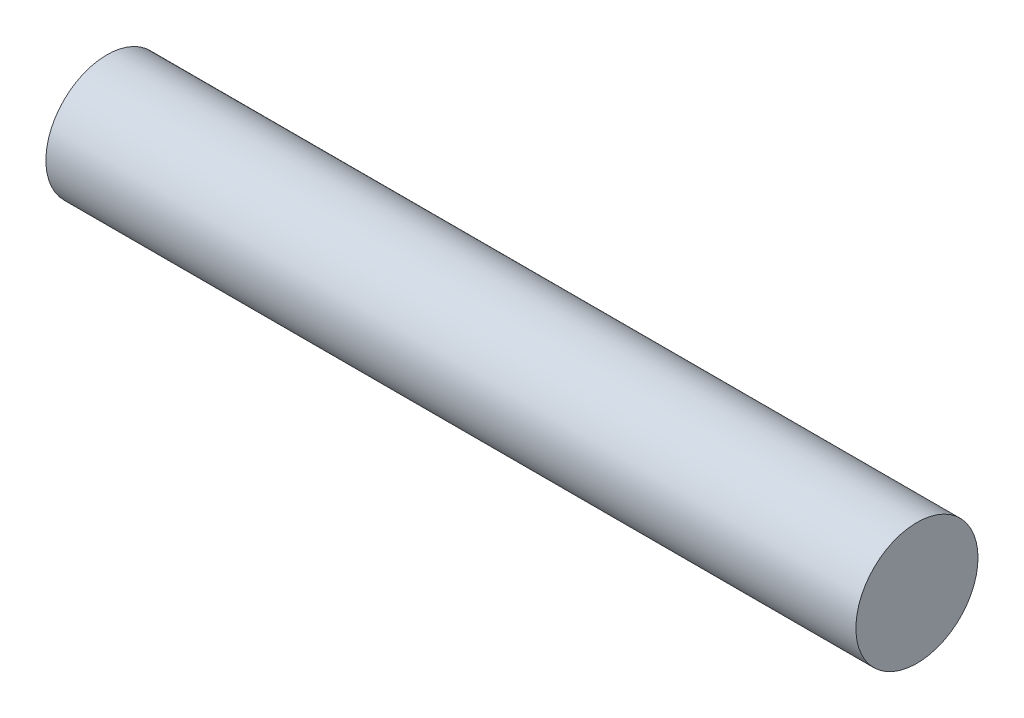
ISO-10303-21;
HEADER;
FILE_DESCRIPTION(('STEP AP214'),'2;1');
FILE_NAME('part.step','',(''),(''),'','','');
FILE_SCHEMA(('AUTOMOTIVE_DESIGN { 1 0 10303 214 1 1 1 1 }'));
ENDSEC;
DATA;
#1=APPLICATION_CONTEXT('core data for automotive mechanical design processes');
#2=APPLICATION_PROTOCOL_DEFINITION('international standard','automotive_design',2000,#1);
#3=PRODUCT_CONTEXT('',#1,'mechanical');
#4=PRODUCT('Part','Part','',(#3));
#5=PRODUCT_RELATED_PRODUCT_CATEGORY('part','',(#4));
#6=PRODUCT_DEFINITION_FORMATION('','',#4);
#7=PRODUCT_DEFINITION_CONTEXT('part definition',#1,'design');
#8=PRODUCT_DEFINITION('design','',#6,#7);
#9=PRODUCT_DEFINITION_SHAPE('','',#8);
#10=(LENGTH_UNIT() NAMED_UNIT(*) SI_UNIT(.MILLI.,.METRE.));
#11=(NAMED_UNIT(*) PLANE_ANGLE_UNIT() SI_UNIT($,.RADIAN.));
#12=(NAMED_UNIT(*) SI_UNIT($,.STERADIAN.) SOLID_ANGLE_UNIT());
#13=UNCERTAINTY_MEASURE_WITH_UNIT(LENGTH_MEASURE(1.E-05),#10,'distance_accuracy_value','');
#14=(GEOMETRIC_REPRESENTATION_CONTEXT(3) GLOBAL_UNCERTAINTY_ASSIGNED_CONTEXT((#13)) GLOBAL_UNIT_ASSIGNED_CONTEXT((#10,
#11,#12)) REPRESENTATION_CONTEXT('',''));
#15=CARTESIAN_POINT('',(0.,0.,0.));
#16=DIRECTION('',(0.,0.,1.));
#17=DIRECTION('',(1.,0.,0.));
#18=AXIS2_PLACEMENT_3D('',#15,#16,#17);
#19=CARTESIAN_POINT('',(-9.95,0.,0.));
#20=DIRECTION('',(-1.,0.,0.));
#21=DIRECTION('',(0.,0.,1.));
#22=AXIS2_PLACEMENT_3D('',#19,#20,#21);
#23=PLANE('',#22);
#24=CARTESIAN_POINT('',(-9.95,0.,0.));
#25=DIRECTION('',(1.,0.,0.));
#26=DIRECTION('',(0.,0.,-1.));
#27=AXIS2_PLACEMENT_3D('',#24,#25,#26);
#28=CIRCLE('',#27,1.5);
#29=CARTESIAN_POINT('',(-9.95,0.,-1.5));
#30=VERTEX_POINT('',#29);
#31=EDGE_CURVE('E10',#30,#30,#28,.T.);
#32=ORIENTED_EDGE('',*,*,#31,.F.);
#33=EDGE_LOOP('',(#32));
#34=FACE_BOUND('',#33,.T.);
#35=ADVANCED_FACE('F37',(#34),#23,.T.);
#36=CARTESIAN_POINT('',(9.95,0.,0.));
#37=DIRECTION('',(1.,0.,0.));
#38=DIRECTION('',(0.,0.,-1.));
#39=AXIS2_PLACEMENT_3D('',#36,#37,#38);
#40=CYLINDRICAL_SURFACE('',#39,1.5);
#41=ORIENTED_EDGE('',*,*,#31,.T.);
#42=EDGE_LOOP('',(#41));
#43=FACE_BOUND('',#42,.T.);
#44=CARTESIAN_POINT('',(9.95,0.,0.));
#45=DIRECTION('',(1.,0.,0.));
#46=DIRECTION('',(0.,0.,-1.));
#47=AXIS2_PLACEMENT_3D('',#44,#45,#46);
#48=CIRCLE('',#47,1.5);
#49=CARTESIAN_POINT('',(9.95,0.,-1.5));
#50=VERTEX_POINT('',#49);
#51=EDGE_CURVE('E43',#50,#50,#48,.T.);
#52=ORIENTED_EDGE('',*,*,#51,.F.);
#53=EDGE_LOOP('',(#52));
#54=FACE_BOUND('',#53,.T.);
#55=ADVANCED_FACE('F51',(#43,#54),#40,.T.);
#56=CARTESIAN_POINT('',(9.95,1.5,0.));
#57=DIRECTION('',(1.,0.,0.));
#58=DIRECTION('',(0.,0.,-1.));
#59=AXIS2_PLACEMENT_3D('',#56,#57,#58);
#60=PLANE('',#59);
#61=ORIENTED_EDGE('',*,*,#51,.T.);
#62=EDGE_LOOP('',(#61));
#63=FACE_BOUND('',#62,.T.);
#64=ADVANCED_FACE('F49',(#63),#60,.T.);
#65=CLOSED_SHELL('',(#35,#55,#64));
#66=MANIFOLD_SOLID_BREP('B2',#65);
#67=ADVANCED_BREP_SHAPE_REPRESENTATION('',(#18,#66),#14);
#68=SHAPE_DEFINITION_REPRESENTATION(#9,#67);
ENDSEC;
END-ISO-10303-21;
